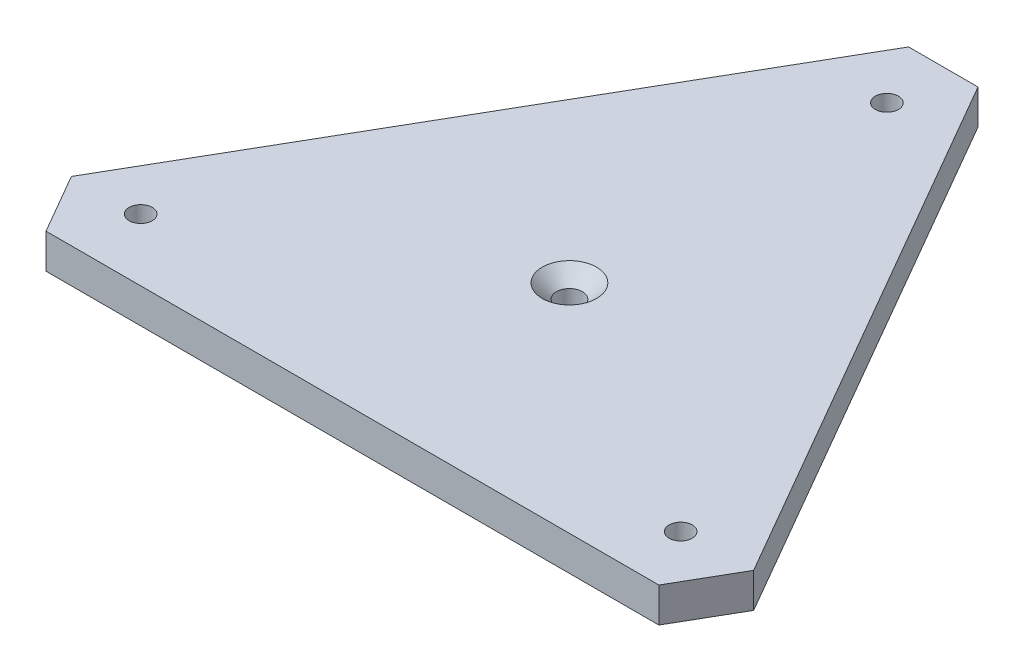
ISO-10303-21;
HEADER;
FILE_DESCRIPTION(('STEP AP214'),'2;1');
FILE_NAME('part.step','',(''),(''),'','','');
FILE_SCHEMA(('AUTOMOTIVE_DESIGN { 1 0 10303 214 1 1 1 1 }'));
ENDSEC;
DATA;
#1=APPLICATION_CONTEXT('core data for automotive mechanical design processes');
#2=APPLICATION_PROTOCOL_DEFINITION('international standard','automotive_design',2000,#1);
#3=PRODUCT_CONTEXT('',#1,'mechanical');
#4=PRODUCT('Part','Part','',(#3));
#5=PRODUCT_RELATED_PRODUCT_CATEGORY('part','',(#4));
#6=PRODUCT_DEFINITION_FORMATION('','',#4);
#7=PRODUCT_DEFINITION_CONTEXT('part definition',#1,'design');
#8=PRODUCT_DEFINITION('design','',#6,#7);
#9=PRODUCT_DEFINITION_SHAPE('','',#8);
#10=(LENGTH_UNIT() NAMED_UNIT(*) SI_UNIT(.MILLI.,.METRE.));
#11=(NAMED_UNIT(*) PLANE_ANGLE_UNIT() SI_UNIT($,.RADIAN.));
#12=(NAMED_UNIT(*) SI_UNIT($,.STERADIAN.) SOLID_ANGLE_UNIT());
#13=UNCERTAINTY_MEASURE_WITH_UNIT(LENGTH_MEASURE(1.E-05),#10,'distance_accuracy_value','');
#14=(GEOMETRIC_REPRESENTATION_CONTEXT(3) GLOBAL_UNCERTAINTY_ASSIGNED_CONTEXT((#13)) GLOBAL_UNIT_ASSIGNED_CONTEXT((#10,
#11,#12)) REPRESENTATION_CONTEXT('',''));
#15=CARTESIAN_POINT('',(0.,0.,0.));
#16=DIRECTION('',(0.,0.,1.));
#17=DIRECTION('',(1.,0.,0.));
#18=AXIS2_PLACEMENT_3D('',#15,#16,#17);
#19=CARTESIAN_POINT('',(0.,6.,37.5277674973257));
#20=DIRECTION('',(0.,0.,-1.));
#21=DIRECTION('',(-1.,0.,0.));
#22=AXIS2_PLACEMENT_3D('',#19,#20,#21);
#23=PLANE('',#22);
#24=DIRECTION('',(1.,0.,0.));
#25=VECTOR('',#24,1.);
#26=CARTESIAN_POINT('',(0.,0.,37.5277674973257));
#27=LINE('',#26,#25);
#28=CARTESIAN_POINT('',(-53.,0.,37.5277674973257));
#29=VERTEX_POINT('',#28);
#30=CARTESIAN_POINT('',(53.,0.,37.5277674973257));
#31=VERTEX_POINT('',#30);
#32=EDGE_CURVE('E406',#29,#31,#27,.T.);
#33=ORIENTED_EDGE('',*,*,#32,.T.);
#34=DIRECTION('',(0.,-1.,0.));
#35=VECTOR('',#34,1.);
#36=CARTESIAN_POINT('',(53.,6.,37.5277674973257));
#37=LINE('',#36,#35);
#38=CARTESIAN_POINT('',(53.,6.,37.5277674973257));
#39=VERTEX_POINT('',#38);
#40=EDGE_CURVE('E470',#39,#31,#37,.T.);
#41=ORIENTED_EDGE('',*,*,#40,.F.);
#42=DIRECTION('',(1.,0.,0.));
#43=VECTOR('',#42,1.);
#44=CARTESIAN_POINT('',(0.,6.,37.5277674973257));
#45=LINE('',#44,#43);
#46=CARTESIAN_POINT('',(-53.,6.,37.5277674973257));
#47=VERTEX_POINT('',#46);
#48=EDGE_CURVE('E408',#47,#39,#45,.T.);
#49=ORIENTED_EDGE('',*,*,#48,.F.);
#50=DIRECTION('',(0.,-1.,0.));
#51=VECTOR('',#50,1.);
#52=CARTESIAN_POINT('',(-53.,6.,37.5277674973257));
#53=LINE('',#52,#51);
#54=EDGE_CURVE('E427',#47,#29,#53,.T.);
#55=ORIENTED_EDGE('',*,*,#54,.T.);
#56=EDGE_LOOP('',(#33,#41,#49,#55));
#57=FACE_BOUND('',#56,.T.);
#58=ADVANCED_FACE('F50',(#57),#23,.F.);
#59=CARTESIAN_POINT('',(55.9999999999999,6.,32.3316150746193));
#60=DIRECTION('',(-0.866025403784437,0.,-0.500000000000004));
#61=DIRECTION('',(-0.500000000000004,0.,0.866025403784437));
#62=AXIS2_PLACEMENT_3D('',#59,#60,#61);
#63=PLANE('',#62);
#64=DIRECTION('',(0.500000000000004,0.,-0.866025403784437));
#65=VECTOR('',#64,1.);
#66=CARTESIAN_POINT('',(55.9999999999999,0.,32.3316150746193));
#67=LINE('',#66,#65);
#68=CARTESIAN_POINT('',(59.,0.,27.1354626519125));
#69=VERTEX_POINT('',#68);
#70=EDGE_CURVE('E432',#31,#69,#67,.T.);
#71=ORIENTED_EDGE('',*,*,#70,.T.);
#72=DIRECTION('',(0.,-1.,0.));
#73=VECTOR('',#72,1.);
#74=CARTESIAN_POINT('',(59.,6.,27.1354626519125));
#75=LINE('',#74,#73);
#76=CARTESIAN_POINT('',(59.,6.,27.1354626519125));
#77=VERTEX_POINT('',#76);
#78=EDGE_CURVE('E464',#77,#69,#75,.T.);
#79=ORIENTED_EDGE('',*,*,#78,.F.);
#80=DIRECTION('',(0.500000000000004,0.,-0.866025403784437));
#81=VECTOR('',#80,1.);
#82=CARTESIAN_POINT('',(55.9999999999999,6.,32.3316150746193));
#83=LINE('',#82,#81);
#84=EDGE_CURVE('E413',#39,#77,#83,.T.);
#85=ORIENTED_EDGE('',*,*,#84,.F.);
#86=ORIENTED_EDGE('',*,*,#40,.T.);
#87=EDGE_LOOP('',(#71,#79,#85,#86));
#88=FACE_BOUND('',#87,.T.);
#89=ADVANCED_FACE('F612',(#88),#63,.F.);
#90=CARTESIAN_POINT('',(32.5,6.,-18.7638837486628));
#91=DIRECTION('',(-0.866025403784438,0.,0.5));
#92=DIRECTION('',(0.5,0.,0.866025403784439));
#93=AXIS2_PLACEMENT_3D('',#90,#91,#92);
#94=PLANE('',#93);
#95=DIRECTION('',(-0.5,0.,-0.866025403784439));
#96=VECTOR('',#95,1.);
#97=CARTESIAN_POINT('',(32.5,0.,-18.7638837486628));
#98=LINE('',#97,#96);
#99=CARTESIAN_POINT('',(5.99999999999996,0.,-64.6632301492381));
#100=VERTEX_POINT('',#99);
#101=EDGE_CURVE('E440',#69,#100,#98,.T.);
#102=ORIENTED_EDGE('',*,*,#101,.T.);
#103=DIRECTION('',(0.,-1.,0.));
#104=VECTOR('',#103,1.);
#105=CARTESIAN_POINT('',(5.99999999999996,6.,-64.6632301492381));
#106=LINE('',#105,#104);
#107=CARTESIAN_POINT('',(5.99999999999996,6.,-64.6632301492381));
#108=VERTEX_POINT('',#107);
#109=EDGE_CURVE('E458',#108,#100,#106,.T.);
#110=ORIENTED_EDGE('',*,*,#109,.F.);
#111=DIRECTION('',(-0.5,0.,-0.866025403784439));
#112=VECTOR('',#111,1.);
#113=CARTESIAN_POINT('',(32.5,6.,-18.7638837486628));
#114=LINE('',#113,#112);
#115=EDGE_CURVE('E419',#77,#108,#114,.T.);
#116=ORIENTED_EDGE('',*,*,#115,.F.);
#117=ORIENTED_EDGE('',*,*,#78,.T.);
#118=EDGE_LOOP('',(#102,#110,#116,#117));
#119=FACE_BOUND('',#118,.T.);
#120=ADVANCED_FACE('F618',(#119),#94,.F.);
#121=CARTESIAN_POINT('',(2.24345646744749E-13,6.,-64.6632301492381));
#122=DIRECTION('',(0.,0.,1.));
#123=DIRECTION('',(1.,0.,0.));
#124=AXIS2_PLACEMENT_3D('',#121,#122,#123);
#125=PLANE('',#124);
#126=DIRECTION('',(-1.,0.,0.));
#127=VECTOR('',#126,1.);
#128=CARTESIAN_POINT('',(2.24345646744749E-13,0.,-64.6632301492381));
#129=LINE('',#128,#127);
#130=CARTESIAN_POINT('',(-5.99999999999995,0.,-64.6632301492382));
#131=VERTEX_POINT('',#130);
#132=EDGE_CURVE('E439',#100,#131,#129,.T.);
#133=ORIENTED_EDGE('',*,*,#132,.T.);
#134=DIRECTION('',(0.,-1.,0.));
#135=VECTOR('',#134,1.);
#136=CARTESIAN_POINT('',(-5.99999999999995,6.,-64.6632301492382));
#137=LINE('',#136,#135);
#138=CARTESIAN_POINT('',(-5.99999999999995,6.,-64.6632301492382));
#139=VERTEX_POINT('',#138);
#140=EDGE_CURVE('E453',#139,#131,#137,.T.);
#141=ORIENTED_EDGE('',*,*,#140,.F.);
#142=DIRECTION('',(-1.,0.,0.));
#143=VECTOR('',#142,1.);
#144=CARTESIAN_POINT('',(2.24345646744749E-13,6.,-64.6632301492381));
#145=LINE('',#144,#143);
#146=EDGE_CURVE('E423',#108,#139,#145,.T.);
#147=ORIENTED_EDGE('',*,*,#146,.F.);
#148=ORIENTED_EDGE('',*,*,#109,.T.);
#149=EDGE_LOOP('',(#133,#141,#147,#148));
#150=FACE_BOUND('',#149,.T.);
#151=ADVANCED_FACE('F637',(#150),#125,.F.);
#152=CARTESIAN_POINT('',(-32.5,6.,-18.7638837486628));
#153=DIRECTION('',(0.866025403784438,0.,0.5));
#154=DIRECTION('',(0.5,0.,-0.866025403784439));
#155=AXIS2_PLACEMENT_3D('',#152,#153,#154);
#156=PLANE('',#155);
#157=DIRECTION('',(-0.5,0.,0.866025403784439));
#158=VECTOR('',#157,1.);
#159=CARTESIAN_POINT('',(-32.5,0.,-18.7638837486628));
#160=LINE('',#159,#158);
#161=CARTESIAN_POINT('',(-59.,0.,27.1354626519123));
#162=VERTEX_POINT('',#161);
#163=EDGE_CURVE('E442',#131,#162,#160,.T.);
#164=ORIENTED_EDGE('',*,*,#163,.T.);
#165=DIRECTION('',(0.,-1.,0.));
#166=VECTOR('',#165,1.);
#167=CARTESIAN_POINT('',(-59.,6.,27.1354626519123));
#168=LINE('',#167,#166);
#169=CARTESIAN_POINT('',(-59.,6.,27.1354626519123));
#170=VERTEX_POINT('',#169);
#171=EDGE_CURVE('E452',#170,#162,#168,.T.);
#172=ORIENTED_EDGE('',*,*,#171,.F.);
#173=DIRECTION('',(-0.5,0.,0.866025403784439));
#174=VECTOR('',#173,1.);
#175=CARTESIAN_POINT('',(-32.5,6.,-18.7638837486628));
#176=LINE('',#175,#174);
#177=EDGE_CURVE('E425',#139,#170,#176,.T.);
#178=ORIENTED_EDGE('',*,*,#177,.F.);
#179=ORIENTED_EDGE('',*,*,#140,.T.);
#180=EDGE_LOOP('',(#164,#172,#178,#179));
#181=FACE_BOUND('',#180,.T.);
#182=ADVANCED_FACE('F634',(#181),#156,.F.);
#183=CARTESIAN_POINT('',(-56.0000000000001,6.,32.3316150746188));
#184=DIRECTION('',(0.866025403784441,0.,-0.499999999999996));
#185=DIRECTION('',(-0.499999999999996,0.,-0.866025403784441));
#186=AXIS2_PLACEMENT_3D('',#183,#184,#185);
#187=PLANE('',#186);
#188=DIRECTION('',(0.499999999999996,0.,0.866025403784441));
#189=VECTOR('',#188,1.);
#190=CARTESIAN_POINT('',(-56.0000000000001,0.,32.3316150746188));
#191=LINE('',#190,#189);
#192=EDGE_CURVE('E414',#162,#29,#191,.T.);
#193=ORIENTED_EDGE('',*,*,#192,.T.);
#194=ORIENTED_EDGE('',*,*,#54,.F.);
#195=DIRECTION('',(0.499999999999996,0.,0.866025403784441));
#196=VECTOR('',#195,1.);
#197=CARTESIAN_POINT('',(-56.0000000000001,6.,32.3316150746188));
#198=LINE('',#197,#196);
#199=EDGE_CURVE('E430',#170,#47,#198,.T.);
#200=ORIENTED_EDGE('',*,*,#199,.F.);
#201=ORIENTED_EDGE('',*,*,#171,.T.);
#202=EDGE_LOOP('',(#193,#194,#200,#201));
#203=FACE_BOUND('',#202,.T.);
#204=ADVANCED_FACE('F493',(#203),#187,.F.);
#205=CARTESIAN_POINT('',(0.,6.,0.));
#206=DIRECTION('',(0.,1.,0.));
#207=DIRECTION('',(0.,0.,1.));
#208=AXIS2_PLACEMENT_3D('',#205,#206,#207);
#209=PLANE('',#208);
#210=CARTESIAN_POINT('',(-47.3727409249304,6.000012,26.7800196226992));
#211=DIRECTION('',(0.,1.,0.));
#212=DIRECTION('',(0.,0.,1.));
#213=AXIS2_PLACEMENT_3D('',#210,#211,#212);
#214=CIRCLE('',#213,1.99999999999998);
#215=CARTESIAN_POINT('',(-47.3727409249304,6.000012,28.7800196226991));
#216=VERTEX_POINT('',#215);
#217=EDGE_CURVE('E347',#216,#216,#214,.T.);
#218=ORIENTED_EDGE('',*,*,#217,.F.);
#219=EDGE_LOOP('',(#218));
#220=FACE_BOUND('',#219,.T.);
#221=CARTESIAN_POINT('',(0.49419315536223,6.000012,-54.4160068992381));
#222=DIRECTION('',(0.,1.,0.));
#223=DIRECTION('',(0.,0.,1.));
#224=AXIS2_PLACEMENT_3D('',#221,#222,#223);
#225=CIRCLE('',#224,1.99999999999997);
#226=CARTESIAN_POINT('',(0.49419315536223,6.000012,-52.4160068992381));
#227=VERTEX_POINT('',#226);
#228=EDGE_CURVE('E512',#227,#227,#225,.T.);
#229=ORIENTED_EDGE('',*,*,#228,.F.);
#230=EDGE_LOOP('',(#229));
#231=FACE_BOUND('',#230,.T.);
#232=CARTESIAN_POINT('',(46.8785477695682,6.000012,27.6359872765393));
#233=DIRECTION('',(0.,1.,0.));
#234=DIRECTION('',(0.,0.,1.));
#235=AXIS2_PLACEMENT_3D('',#232,#233,#234);
#236=CIRCLE('',#235,1.99999999999997);
#237=CARTESIAN_POINT('',(46.8785477695682,6.000012,29.6359872765393));
#238=VERTEX_POINT('',#237);
#239=EDGE_CURVE('E389',#238,#238,#236,.T.);
#240=ORIENTED_EDGE('',*,*,#239,.F.);
#241=EDGE_LOOP('',(#240));
#242=FACE_BOUND('',#241,.T.);
#243=CARTESIAN_POINT('',(0.,6.,0.));
#244=DIRECTION('',(0.,1.,0.));
#245=DIRECTION('',(0.,0.,1.));
#246=AXIS2_PLACEMENT_3D('',#243,#244,#245);
#247=CIRCLE('',#246,4.7);
#248=CARTESIAN_POINT('',(0.,6.,4.7));
#249=VERTEX_POINT('',#248);
#250=EDGE_CURVE('E395',#249,#249,#247,.T.);
#251=ORIENTED_EDGE('',*,*,#250,.F.);
#252=EDGE_LOOP('',(#251));
#253=FACE_BOUND('',#252,.T.);
#254=ORIENTED_EDGE('',*,*,#48,.T.);
#255=ORIENTED_EDGE('',*,*,#84,.T.);
#256=ORIENTED_EDGE('',*,*,#115,.T.);
#257=ORIENTED_EDGE('',*,*,#146,.T.);
#258=ORIENTED_EDGE('',*,*,#177,.T.);
#259=ORIENTED_EDGE('',*,*,#199,.T.);
#260=EDGE_LOOP('',(#254,#255,#256,#257,#258,#259));
#261=FACE_BOUND('',#260,.T.);
#262=ADVANCED_FACE('F479',(#220,#231,#242,#253,#261),#209,.T.);
#263=CARTESIAN_POINT('',(0.,0.,0.));
#264=DIRECTION('',(0.,1.,0.));
#265=DIRECTION('',(0.,0.,1.));
#266=AXIS2_PLACEMENT_3D('',#263,#264,#265);
#267=PLANE('',#266);
#268=DIRECTION('',(0.909561910988799,0.,-0.415568442110808));
#269=VECTOR('',#268,1.);
#270=CARTESIAN_POINT('',(3.36463729136853,0.,7.36424043408311));
#271=LINE('',#270,#269);
#272=CARTESIAN_POINT('',(-47.7480091741784,0.,30.7170244581597));
#273=VERTEX_POINT('',#272);
#274=CARTESIAN_POINT('',(-44.1508288472234,0.,29.0735138775119));
#275=VERTEX_POINT('',#274);
#276=EDGE_CURVE('E54',#273,#275,#271,.T.);
#277=ORIENTED_EDGE('',*,*,#276,.T.);
#278=DIRECTION('',(0.0948881276153086,0.,-0.995487942286425));
#279=VECTOR('',#278,1.);
#280=CARTESIAN_POINT('',(-41.0070217832119,0.,-3.90871586767005));
#281=LINE('',#280,#279);
#282=CARTESIAN_POINT('',(-43.7755605979754,0.,25.1365090420513));
#283=VERTEX_POINT('',#282);
#284=EDGE_CURVE('E11',#275,#283,#281,.T.);
#285=ORIENTED_EDGE('',*,*,#284,.T.);
#286=DIRECTION('',(-0.814673783373487,0.,-0.57991950017561));
#287=VECTOR('',#286,1.);
#288=CARTESIAN_POINT('',(-26.59763449089,0.,37.364488541801));
#289=LINE('',#288,#287);
#290=CARTESIAN_POINT('',(-46.9974726756825,0.,22.8430147872386));
#291=VERTEX_POINT('',#290);
#292=EDGE_CURVE('E212',#283,#291,#289,.T.);
#293=ORIENTED_EDGE('',*,*,#292,.T.);
#294=DIRECTION('',(-0.909561910988797,0.,0.415568442110812));
#295=VECTOR('',#294,1.);
#296=CARTESIAN_POINT('',(0.517993462909389,0.,1.13374134380959));
#297=LINE('',#296,#295);
#298=CARTESIAN_POINT('',(-50.5946530026374,0.,24.4865253678864));
#299=VERTEX_POINT('',#298);
#300=EDGE_CURVE('E574',#291,#299,#297,.T.);
#301=ORIENTED_EDGE('',*,*,#300,.T.);
#302=DIRECTION('',(-0.0948881276153154,0.,0.995487942286425));
#303=VECTOR('',#302,1.);
#304=CARTESIAN_POINT('',(-47.8261141878737,0.,-4.55869954183522));
#305=LINE('',#304,#303);
#306=CARTESIAN_POINT('',(-50.9699212518854,0.,28.423530203347));
#307=VERTEX_POINT('',#306);
#308=EDGE_CURVE('E576',#299,#307,#305,.T.);
#309=ORIENTED_EDGE('',*,*,#308,.T.);
#310=DIRECTION('',(0.814673783373483,0.,0.579919500175615));
#311=VECTOR('',#310,1.);
#312=CARTESIAN_POINT('',(-30.5700830670934,0.,42.9450039579093));
#313=LINE('',#312,#311);
#314=EDGE_CURVE('E584',#307,#273,#313,.T.);
#315=ORIENTED_EDGE('',*,*,#314,.T.);
#316=EDGE_LOOP('',(#277,#285,#293,#301,#309,#315));
#317=FACE_BOUND('',#316,.T.);
#318=DIRECTION('',(-0.0948881276153142,0.,0.995487942286425));
#319=VECTOR('',#318,1.);
#320=CARTESIAN_POINT('',(-8.05993794117638,0.,-0.768258848195882));
#321=LINE('',#320,#319);
#322=CARTESIAN_POINT('',(-2.72771892234482,0.,-56.7095011540507));
#323=VERTEX_POINT('',#322);
#324=CARTESIAN_POINT('',(-3.10298717159278,0.,-52.7724963185902));
#325=VERTEX_POINT('',#324);
#326=EDGE_CURVE('E564',#323,#325,#321,.T.);
#327=ORIENTED_EDGE('',*,*,#326,.T.);
#328=DIRECTION('',(0.814673783373484,0.,0.579919500175614));
#329=VECTOR('',#328,1.);
#330=CARTESIAN_POINT('',(23.8885581291837,0.,-33.5587646639682));
#331=LINE('',#330,#329);
#332=CARTESIAN_POINT('',(0.118924906114242,0.,-50.4790020637775));
#333=VERTEX_POINT('',#332);
#334=EDGE_CURVE('E567',#325,#333,#331,.T.);
#335=ORIENTED_EDGE('',*,*,#334,.T.);
#336=DIRECTION('',(0.909561910988798,0.,-0.415568442110811));
#337=VECTOR('',#336,1.);
#338=CARTESIAN_POINT('',(-19.059779031167,0.,-41.7164714205846));
#339=LINE('',#338,#337);
#340=CARTESIAN_POINT('',(3.71610523306925,0.,-52.1225126444253));
#341=VERTEX_POINT('',#340);
#342=EDGE_CURVE('E546',#333,#341,#339,.T.);
#343=ORIENTED_EDGE('',*,*,#342,.T.);
#344=DIRECTION('',(0.0948881276153139,0.,-0.995487942286425));
#345=VECTOR('',#344,1.);
#346=CARTESIAN_POINT('',(-1.24084553651433,0.,-0.118275174030975));
#347=LINE('',#346,#345);
#348=CARTESIAN_POINT('',(4.09137348231721,0.,-56.0595174798858));
#349=VERTEX_POINT('',#348);
#350=EDGE_CURVE('E551',#341,#349,#347,.T.);
#351=ORIENTED_EDGE('',*,*,#350,.T.);
#352=DIRECTION('',(-0.814673783373485,0.,-0.579919500175613));
#353=VECTOR('',#352,1.);
#354=CARTESIAN_POINT('',(27.8610067053867,0.,-39.1392800800767));
#355=LINE('',#354,#353);
#356=CARTESIAN_POINT('',(0.869461404610184,0.,-58.3530117346986));
#357=VERTEX_POINT('',#356);
#358=EDGE_CURVE('E560',#349,#357,#355,.T.);
#359=ORIENTED_EDGE('',*,*,#358,.T.);
#360=DIRECTION('',(-0.909561910988797,0.,0.415568442110813));
#361=VECTOR('',#360,1.);
#362=CARTESIAN_POINT('',(-21.9064228596262,0.,-47.9469705108577));
#363=LINE('',#362,#361);
#364=EDGE_CURVE('E561',#357,#323,#363,.T.);
#365=ORIENTED_EDGE('',*,*,#364,.T.);
#366=EDGE_LOOP('',(#327,#335,#343,#351,#359,#365));
#367=FACE_BOUND('',#366,.T.);
#368=DIRECTION('',(-0.814673783373481,0.,-0.579919500175618));
#369=VECTOR('',#368,1.);
#370=CARTESIAN_POINT('',(4.69530064980804,0.,-6.59598158588684));
#371=LINE('',#370,#369);
#372=CARTESIAN_POINT('',(50.4757280965232,0.,25.9924766958915));
#373=VERTEX_POINT('',#372);
#374=CARTESIAN_POINT('',(47.2538160188162,0.,23.6989824410788));
#375=VERTEX_POINT('',#374);
#376=EDGE_CURVE('E541',#373,#375,#371,.T.);
#377=ORIENTED_EDGE('',*,*,#376,.T.);
#378=DIRECTION('',(-0.9095619109888,0.,0.415568442110807));
#379=VECTOR('',#378,1.);
#380=CARTESIAN_POINT('',(17.118463654028,0.,37.4674805316386));
#381=LINE('',#380,#379);
#382=CARTESIAN_POINT('',(43.6566356918612,0.,25.3424930217266));
#383=VERTEX_POINT('',#382);
#384=EDGE_CURVE('E544',#375,#383,#381,.T.);
#385=ORIENTED_EDGE('',*,*,#384,.T.);
#386=DIRECTION('',(-0.094888127615319,0.,0.995487942286424));
#387=VECTOR('',#386,1.);
#388=CARTESIAN_POINT('',(45.6574135220572,0.,4.35198287878392));
#389=LINE('',#388,#387);
#390=CARTESIAN_POINT('',(43.2813674426132,0.,29.2794978571871));
#391=VERTEX_POINT('',#390);
#392=EDGE_CURVE('E472',#383,#391,#389,.T.);
#393=ORIENTED_EDGE('',*,*,#392,.T.);
#394=DIRECTION('',(0.814673783373481,0.,0.579919500175618));
#395=VECTOR('',#394,1.);
#396=CARTESIAN_POINT('',(0.722852073605022,0.,-1.01546616977845));
#397=LINE('',#396,#395);
#398=CARTESIAN_POINT('',(46.5032795203202,0.,31.5729921119999));
#399=VERTEX_POINT('',#398);
#400=EDGE_CURVE('E526',#391,#399,#397,.T.);
#401=ORIENTED_EDGE('',*,*,#400,.T.);
#402=DIRECTION('',(0.909561910988799,0.,-0.415568442110807));
#403=VECTOR('',#402,1.);
#404=CARTESIAN_POINT('',(19.9651074824871,0.,43.6979796219119));
#405=LINE('',#404,#403);
#406=CARTESIAN_POINT('',(50.1004598472752,0.,29.929481531352));
#407=VERTEX_POINT('',#406);
#408=EDGE_CURVE('E531',#399,#407,#405,.T.);
#409=ORIENTED_EDGE('',*,*,#408,.T.);
#410=DIRECTION('',(0.094888127615317,0.,-0.995487942286424));
#411=VECTOR('',#410,1.);
#412=CARTESIAN_POINT('',(52.4765059267192,0.,5.00196655294875));
#413=LINE('',#412,#411);
#414=EDGE_CURVE('E540',#407,#373,#413,.T.);
#415=ORIENTED_EDGE('',*,*,#414,.T.);
#416=EDGE_LOOP('',(#377,#385,#393,#401,#409,#415));
#417=FACE_BOUND('',#416,.T.);
#418=CARTESIAN_POINT('',(0.,0.,0.));
#419=DIRECTION('',(0.,1.,0.));
#420=DIRECTION('',(0.,0.,1.));
#421=AXIS2_PLACEMENT_3D('',#418,#419,#420);
#422=CIRCLE('',#421,2.25);
#423=CARTESIAN_POINT('',(0.,0.,2.25));
#424=VERTEX_POINT('',#423);
#425=EDGE_CURVE('E403',#424,#424,#422,.T.);
#426=ORIENTED_EDGE('',*,*,#425,.T.);
#427=EDGE_LOOP('',(#426));
#428=FACE_BOUND('',#427,.T.);
#429=ORIENTED_EDGE('',*,*,#32,.F.);
#430=ORIENTED_EDGE('',*,*,#192,.F.);
#431=ORIENTED_EDGE('',*,*,#163,.F.);
#432=ORIENTED_EDGE('',*,*,#132,.F.);
#433=ORIENTED_EDGE('',*,*,#101,.F.);
#434=ORIENTED_EDGE('',*,*,#70,.F.);
#435=EDGE_LOOP('',(#429,#430,#431,#432,#433,#434));
#436=FACE_BOUND('',#435,.T.);
#437=ADVANCED_FACE('F489',(#317,#367,#417,#428,#436),#267,.F.);
#438=CARTESIAN_POINT('',(0.,6.,0.));
#439=DIRECTION('',(0.,1.,0.));
#440=DIRECTION('',(0.,0.,1.));
#441=AXIS2_PLACEMENT_3D('',#438,#439,#440);
#442=CYLINDRICAL_SURFACE('',#441,2.25);
#443=ORIENTED_EDGE('',*,*,#425,.F.);
#444=EDGE_LOOP('',(#443));
#445=FACE_BOUND('',#444,.T.);
#446=CARTESIAN_POINT('',(0.,3.55,0.));
#447=DIRECTION('',(0.,1.,0.));
#448=DIRECTION('',(0.,0.,1.));
#449=AXIS2_PLACEMENT_3D('',#446,#447,#448);
#450=CIRCLE('',#449,2.25);
#451=CARTESIAN_POINT('',(0.,3.55,2.25));
#452=VERTEX_POINT('',#451);
#453=EDGE_CURVE('E402',#452,#452,#450,.T.);
#454=ORIENTED_EDGE('',*,*,#453,.T.);
#455=EDGE_LOOP('',(#454));
#456=FACE_BOUND('',#455,.T.);
#457=ADVANCED_FACE('F491',(#445,#456),#442,.F.);
#458=CARTESIAN_POINT('',(0.,6.,0.));
#459=DIRECTION('',(0.,1.,0.));
#460=DIRECTION('',(0.,0.,1.));
#461=AXIS2_PLACEMENT_3D('',#458,#459,#460);
#462=CONICAL_SURFACE('',#461,4.7,0.785398163397448);
#463=ORIENTED_EDGE('',*,*,#453,.F.);
#464=EDGE_LOOP('',(#463));
#465=FACE_BOUND('',#464,.T.);
#466=ORIENTED_EDGE('',*,*,#250,.T.);
#467=EDGE_LOOP('',(#466));
#468=FACE_BOUND('',#467,.T.);
#469=ADVANCED_FACE('F661',(#465,#468),#462,.F.);
#470=CARTESIAN_POINT('',(46.8785477695682,0.,27.6359872765393));
#471=DIRECTION('',(0.,1.,0.));
#472=DIRECTION('',(0.,0.,1.));
#473=AXIS2_PLACEMENT_3D('',#470,#471,#472);
#474=CYLINDRICAL_SURFACE('',#473,1.99999999999997);
#475=CARTESIAN_POINT('',(46.8785477695682,3.,27.6359872765393));
#476=DIRECTION('',(0.,1.,0.));
#477=DIRECTION('',(0.,0.,1.));
#478=AXIS2_PLACEMENT_3D('',#475,#476,#477);
#479=CIRCLE('',#478,1.99999999999997);
#480=CARTESIAN_POINT('',(46.8785477695682,3.,29.6359872765393));
#481=VERTEX_POINT('',#480);
#482=EDGE_CURVE('E513',#481,#481,#479,.F.);
#483=ORIENTED_EDGE('',*,*,#482,.T.);
#484=EDGE_LOOP('',(#483));
#485=FACE_BOUND('',#484,.T.);
#486=ORIENTED_EDGE('',*,*,#239,.T.);
#487=EDGE_LOOP('',(#486));
#488=FACE_BOUND('',#487,.T.);
#489=ADVANCED_FACE('F375',(#485,#488),#474,.F.);
#490=CARTESIAN_POINT('',(0.49419315536223,0.,-54.4160068992381));
#491=DIRECTION('',(0.,1.,0.));
#492=DIRECTION('',(0.,0.,1.));
#493=AXIS2_PLACEMENT_3D('',#490,#491,#492);
#494=CYLINDRICAL_SURFACE('',#493,1.99999999999997);
#495=CARTESIAN_POINT('',(0.49419315536223,3.,-54.4160068992381));
#496=DIRECTION('',(0.,1.,0.));
#497=DIRECTION('',(0.,0.,1.));
#498=AXIS2_PLACEMENT_3D('',#495,#496,#497);
#499=CIRCLE('',#498,1.99999999999997);
#500=CARTESIAN_POINT('',(0.49419315536223,3.,-52.4160068992381));
#501=VERTEX_POINT('',#500);
#502=EDGE_CURVE('E519',#501,#501,#499,.F.);
#503=ORIENTED_EDGE('',*,*,#502,.T.);
#504=EDGE_LOOP('',(#503));
#505=FACE_BOUND('',#504,.T.);
#506=ORIENTED_EDGE('',*,*,#228,.T.);
#507=EDGE_LOOP('',(#506));
#508=FACE_BOUND('',#507,.T.);
#509=ADVANCED_FACE('F362',(#505,#508),#494,.F.);
#510=CARTESIAN_POINT('',(-47.3727409249304,0.,26.7800196226992));
#511=DIRECTION('',(0.,1.,0.));
#512=DIRECTION('',(0.,0.,1.));
#513=AXIS2_PLACEMENT_3D('',#510,#511,#512);
#514=CYLINDRICAL_SURFACE('',#513,1.99999999999998);
#515=CARTESIAN_POINT('',(-47.3727409249304,3.,26.7800196226992));
#516=DIRECTION('',(0.,1.,0.));
#517=DIRECTION('',(0.,0.,1.));
#518=AXIS2_PLACEMENT_3D('',#515,#516,#517);
#519=CIRCLE('',#518,1.99999999999998);
#520=CARTESIAN_POINT('',(-47.3727409249304,3.,28.7800196226991));
#521=VERTEX_POINT('',#520);
#522=EDGE_CURVE('E253',#521,#521,#519,.F.);
#523=ORIENTED_EDGE('',*,*,#522,.T.);
#524=EDGE_LOOP('',(#523));
#525=FACE_BOUND('',#524,.T.);
#526=ORIENTED_EDGE('',*,*,#217,.T.);
#527=EDGE_LOOP('',(#526));
#528=FACE_BOUND('',#527,.T.);
#529=ADVANCED_FACE('F353',(#525,#528),#514,.F.);
#530=CARTESIAN_POINT('',(-44.1508288472234,-7.,29.0735138775119));
#531=DIRECTION('',(0.995487942286425,0.,0.0948881276153086));
#532=DIRECTION('',(0.0948881276153086,0.,-0.995487942286425));
#533=AXIS2_PLACEMENT_3D('',#530,#531,#532);
#534=PLANE('',#533);
#535=DIRECTION('',(0.,1.,0.));
#536=VECTOR('',#535,1.);
#537=CARTESIAN_POINT('',(-44.1508288472234,-7.,29.0735138775119));
#538=LINE('',#537,#536);
#539=CARTESIAN_POINT('',(-44.1508288472234,3.,29.0735138775119));
#540=VERTEX_POINT('',#539);
#541=EDGE_CURVE('E235',#275,#540,#538,.T.);
#542=ORIENTED_EDGE('',*,*,#541,.T.);
#543=DIRECTION('',(0.0948881276153086,0.,-0.995487942286425));
#544=VECTOR('',#543,1.);
#545=CARTESIAN_POINT('',(-44.1508288472234,3.,29.0735138775119));
#546=LINE('',#545,#544);
#547=CARTESIAN_POINT('',(-43.7755605979754,3.,25.1365090420513));
#548=VERTEX_POINT('',#547);
#549=EDGE_CURVE('E224',#540,#548,#546,.T.);
#550=ORIENTED_EDGE('',*,*,#549,.T.);
#551=DIRECTION('',(0.,1.,0.));
#552=VECTOR('',#551,1.);
#553=CARTESIAN_POINT('',(-43.7755605979754,-7.,25.1365090420513));
#554=LINE('',#553,#552);
#555=EDGE_CURVE('E207',#283,#548,#554,.T.);
#556=ORIENTED_EDGE('',*,*,#555,.F.);
#557=ORIENTED_EDGE('',*,*,#284,.F.);
#558=EDGE_LOOP('',(#542,#550,#556,#557));
#559=FACE_BOUND('',#558,.T.);
#560=ADVANCED_FACE('F229',(#559),#534,.F.);
#561=CARTESIAN_POINT('',(-47.7480091741784,-7.,30.7170244581597));
#562=DIRECTION('',(0.415568442110808,0.,0.909561910988799));
#563=DIRECTION('',(0.909561910988799,0.,-0.415568442110808));
#564=AXIS2_PLACEMENT_3D('',#561,#562,#563);
#565=PLANE('',#564);
#566=DIRECTION('',(0.,1.,0.));
#567=VECTOR('',#566,1.);
#568=CARTESIAN_POINT('',(-47.7480091741784,-7.,30.7170244581597));
#569=LINE('',#568,#567);
#570=CARTESIAN_POINT('',(-47.7480091741784,3.,30.7170244581597));
#571=VERTEX_POINT('',#570);
#572=EDGE_CURVE('E257',#273,#571,#569,.T.);
#573=ORIENTED_EDGE('',*,*,#572,.T.);
#574=DIRECTION('',(0.909561910988799,0.,-0.415568442110808));
#575=VECTOR('',#574,1.);
#576=CARTESIAN_POINT('',(-47.7480091741784,3.,30.7170244581597));
#577=LINE('',#576,#575);
#578=EDGE_CURVE('E213',#571,#540,#577,.T.);
#579=ORIENTED_EDGE('',*,*,#578,.T.);
#580=ORIENTED_EDGE('',*,*,#541,.F.);
#581=ORIENTED_EDGE('',*,*,#276,.F.);
#582=EDGE_LOOP('',(#573,#579,#580,#581));
#583=FACE_BOUND('',#582,.T.);
#584=ADVANCED_FACE('F595',(#583),#565,.F.);
#585=CARTESIAN_POINT('',(-50.9699212518854,-7.,28.423530203347));
#586=DIRECTION('',(-0.579919500175615,0.,0.814673783373483));
#587=DIRECTION('',(0.814673783373483,0.,0.579919500175615));
#588=AXIS2_PLACEMENT_3D('',#585,#586,#587);
#589=PLANE('',#588);
#590=DIRECTION('',(0.,1.,0.));
#591=VECTOR('',#590,1.);
#592=CARTESIAN_POINT('',(-50.9699212518854,-7.,28.423530203347));
#593=LINE('',#592,#591);
#594=CARTESIAN_POINT('',(-50.9699212518854,3.,28.423530203347));
#595=VERTEX_POINT('',#594);
#596=EDGE_CURVE('E256',#307,#595,#593,.T.);
#597=ORIENTED_EDGE('',*,*,#596,.T.);
#598=DIRECTION('',(0.814673783373483,0.,0.579919500175615));
#599=VECTOR('',#598,1.);
#600=CARTESIAN_POINT('',(-50.9699212518854,3.,28.423530203347));
#601=LINE('',#600,#599);
#602=EDGE_CURVE('E250',#595,#571,#601,.T.);
#603=ORIENTED_EDGE('',*,*,#602,.T.);
#604=ORIENTED_EDGE('',*,*,#572,.F.);
#605=ORIENTED_EDGE('',*,*,#314,.F.);
#606=EDGE_LOOP('',(#597,#603,#604,#605));
#607=FACE_BOUND('',#606,.T.);
#608=ADVANCED_FACE('F591',(#607),#589,.F.);
#609=CARTESIAN_POINT('',(-50.5946530026374,-7.,24.4865253678864));
#610=DIRECTION('',(-0.995487942286425,0.,-0.0948881276153154));
#611=DIRECTION('',(-0.0948881276153154,0.,0.995487942286425));
#612=AXIS2_PLACEMENT_3D('',#609,#610,#611);
#613=PLANE('',#612);
#614=DIRECTION('',(0.,1.,0.));
#615=VECTOR('',#614,1.);
#616=CARTESIAN_POINT('',(-50.5946530026374,-7.,24.4865253678864));
#617=LINE('',#616,#615);
#618=CARTESIAN_POINT('',(-50.5946530026374,3.,24.4865253678864));
#619=VERTEX_POINT('',#618);
#620=EDGE_CURVE('E265',#299,#619,#617,.T.);
#621=ORIENTED_EDGE('',*,*,#620,.T.);
#622=DIRECTION('',(-0.0948881276153154,0.,0.995487942286424));
#623=VECTOR('',#622,1.);
#624=CARTESIAN_POINT('',(-50.5946530026374,3.,24.4865253678864));
#625=LINE('',#624,#623);
#626=EDGE_CURVE('E243',#619,#595,#625,.T.);
#627=ORIENTED_EDGE('',*,*,#626,.T.);
#628=ORIENTED_EDGE('',*,*,#596,.F.);
#629=ORIENTED_EDGE('',*,*,#308,.F.);
#630=EDGE_LOOP('',(#621,#627,#628,#629));
#631=FACE_BOUND('',#630,.T.);
#632=ADVANCED_FACE('F596',(#631),#613,.F.);
#633=CARTESIAN_POINT('',(-46.9974726756825,-7.,22.8430147872386));
#634=DIRECTION('',(-0.415568442110812,0.,-0.909561910988797));
#635=DIRECTION('',(-0.909561910988797,0.,0.415568442110812));
#636=AXIS2_PLACEMENT_3D('',#633,#634,#635);
#637=PLANE('',#636);
#638=DIRECTION('',(0.,1.,0.));
#639=VECTOR('',#638,1.);
#640=CARTESIAN_POINT('',(-46.9974726756825,-7.,22.8430147872386));
#641=LINE('',#640,#639);
#642=CARTESIAN_POINT('',(-46.9974726756825,3.,22.8430147872386));
#643=VERTEX_POINT('',#642);
#644=EDGE_CURVE('E65',#291,#643,#641,.T.);
#645=ORIENTED_EDGE('',*,*,#644,.T.);
#646=DIRECTION('',(-0.909561910988797,0.,0.415568442110812));
#647=VECTOR('',#646,1.);
#648=CARTESIAN_POINT('',(-46.9974726756825,3.,22.8430147872386));
#649=LINE('',#648,#647);
#650=EDGE_CURVE('E227',#643,#619,#649,.T.);
#651=ORIENTED_EDGE('',*,*,#650,.T.);
#652=ORIENTED_EDGE('',*,*,#620,.F.);
#653=ORIENTED_EDGE('',*,*,#300,.F.);
#654=EDGE_LOOP('',(#645,#651,#652,#653));
#655=FACE_BOUND('',#654,.T.);
#656=ADVANCED_FACE('F602',(#655),#637,.F.);
#657=CARTESIAN_POINT('',(-43.7755605979754,-7.,25.1365090420513));
#658=DIRECTION('',(0.57991950017561,0.,-0.814673783373487));
#659=DIRECTION('',(-0.814673783373487,0.,-0.57991950017561));
#660=AXIS2_PLACEMENT_3D('',#657,#658,#659);
#661=PLANE('',#660);
#662=ORIENTED_EDGE('',*,*,#555,.T.);
#663=DIRECTION('',(-0.814673783373487,0.,-0.57991950017561));
#664=VECTOR('',#663,1.);
#665=CARTESIAN_POINT('',(-43.7755605979754,3.,25.1365090420513));
#666=LINE('',#665,#664);
#667=EDGE_CURVE('E209',#548,#643,#666,.T.);
#668=ORIENTED_EDGE('',*,*,#667,.T.);
#669=ORIENTED_EDGE('',*,*,#644,.F.);
#670=ORIENTED_EDGE('',*,*,#292,.F.);
#671=EDGE_LOOP('',(#662,#668,#669,#670));
#672=FACE_BOUND('',#671,.T.);
#673=ADVANCED_FACE('F206',(#672),#661,.F.);
#674=CARTESIAN_POINT('',(0.,3.,0.));
#675=DIRECTION('',(0.,1.,0.));
#676=DIRECTION('',(0.,0.,1.));
#677=AXIS2_PLACEMENT_3D('',#674,#675,#676);
#678=PLANE('',#677);
#679=ORIENTED_EDGE('',*,*,#549,.F.);
#680=ORIENTED_EDGE('',*,*,#578,.F.);
#681=ORIENTED_EDGE('',*,*,#602,.F.);
#682=ORIENTED_EDGE('',*,*,#626,.F.);
#683=ORIENTED_EDGE('',*,*,#650,.F.);
#684=ORIENTED_EDGE('',*,*,#667,.F.);
#685=EDGE_LOOP('',(#679,#680,#681,#682,#683,#684));
#686=FACE_BOUND('',#685,.T.);
#687=ORIENTED_EDGE('',*,*,#522,.F.);
#688=EDGE_LOOP('',(#687));
#689=FACE_BOUND('',#688,.T.);
#690=ADVANCED_FACE('F219',(#686,#689),#678,.F.);
#691=CARTESIAN_POINT('',(-3.10298717159278,-7.,-52.7724963185902));
#692=DIRECTION('',(-0.579919500175614,0.,0.814673783373484));
#693=DIRECTION('',(0.814673783373484,0.,0.579919500175614));
#694=AXIS2_PLACEMENT_3D('',#691,#692,#693);
#695=PLANE('',#694);
#696=DIRECTION('',(0.,1.,0.));
#697=VECTOR('',#696,1.);
#698=CARTESIAN_POINT('',(-3.10298717159278,-7.,-52.7724963185902));
#699=LINE('',#698,#697);
#700=CARTESIAN_POINT('',(-3.10298717159278,3.,-52.7724963185902));
#701=VERTEX_POINT('',#700);
#702=EDGE_CURVE('E285',#325,#701,#699,.T.);
#703=ORIENTED_EDGE('',*,*,#702,.T.);
#704=DIRECTION('',(0.814673783373484,0.,0.579919500175614));
#705=VECTOR('',#704,1.);
#706=CARTESIAN_POINT('',(-3.10298717159278,3.,-52.7724963185902));
#707=LINE('',#706,#705);
#708=CARTESIAN_POINT('',(0.118924906114242,3.,-50.4790020637775));
#709=VERTEX_POINT('',#708);
#710=EDGE_CURVE('E234',#701,#709,#707,.T.);
#711=ORIENTED_EDGE('',*,*,#710,.T.);
#712=DIRECTION('',(0.,1.,0.));
#713=VECTOR('',#712,1.);
#714=CARTESIAN_POINT('',(0.118924906114242,-7.,-50.4790020637775));
#715=LINE('',#714,#713);
#716=EDGE_CURVE('E270',#333,#709,#715,.T.);
#717=ORIENTED_EDGE('',*,*,#716,.F.);
#718=ORIENTED_EDGE('',*,*,#334,.F.);
#719=EDGE_LOOP('',(#703,#711,#717,#718));
#720=FACE_BOUND('',#719,.T.);
#721=ADVANCED_FACE('F744',(#720),#695,.F.);
#722=CARTESIAN_POINT('',(-2.72771892234482,-7.,-56.7095011540507));
#723=DIRECTION('',(-0.995487942286425,0.,-0.0948881276153142));
#724=DIRECTION('',(-0.0948881276153142,0.,0.995487942286425));
#725=AXIS2_PLACEMENT_3D('',#722,#723,#724);
#726=PLANE('',#725);
#727=DIRECTION('',(0.,1.,0.));
#728=VECTOR('',#727,1.);
#729=CARTESIAN_POINT('',(-2.72771892234482,-7.,-56.7095011540507));
#730=LINE('',#729,#728);
#731=CARTESIAN_POINT('',(-2.72771892234482,3.,-56.7095011540507));
#732=VERTEX_POINT('',#731);
#733=EDGE_CURVE('E276',#323,#732,#730,.T.);
#734=ORIENTED_EDGE('',*,*,#733,.T.);
#735=DIRECTION('',(-0.0948881276153142,0.,0.995487942286425));
#736=VECTOR('',#735,1.);
#737=CARTESIAN_POINT('',(-2.72771892234482,3.,-56.7095011540507));
#738=LINE('',#737,#736);
#739=EDGE_CURVE('E268',#732,#701,#738,.T.);
#740=ORIENTED_EDGE('',*,*,#739,.T.);
#741=ORIENTED_EDGE('',*,*,#702,.F.);
#742=ORIENTED_EDGE('',*,*,#326,.F.);
#743=EDGE_LOOP('',(#734,#740,#741,#742));
#744=FACE_BOUND('',#743,.T.);
#745=ADVANCED_FACE('F755',(#744),#726,.F.);
#746=CARTESIAN_POINT('',(0.869461404610184,-7.,-58.3530117346986));
#747=DIRECTION('',(-0.415568442110813,0.,-0.909561910988797));
#748=DIRECTION('',(-0.909561910988797,0.,0.415568442110813));
#749=AXIS2_PLACEMENT_3D('',#746,#747,#748);
#750=PLANE('',#749);
#751=DIRECTION('',(0.,1.,0.));
#752=VECTOR('',#751,1.);
#753=CARTESIAN_POINT('',(0.869461404610184,-7.,-58.3530117346986));
#754=LINE('',#753,#752);
#755=CARTESIAN_POINT('',(0.869461404610184,3.,-58.3530117346986));
#756=VERTEX_POINT('',#755);
#757=EDGE_CURVE('E277',#357,#756,#754,.T.);
#758=ORIENTED_EDGE('',*,*,#757,.T.);
#759=DIRECTION('',(-0.909561910988797,0.,0.415568442110813));
#760=VECTOR('',#759,1.);
#761=CARTESIAN_POINT('',(0.869461404610184,3.,-58.3530117346986));
#762=LINE('',#761,#760);
#763=EDGE_CURVE('E286',#756,#732,#762,.T.);
#764=ORIENTED_EDGE('',*,*,#763,.T.);
#765=ORIENTED_EDGE('',*,*,#733,.F.);
#766=ORIENTED_EDGE('',*,*,#364,.F.);
#767=EDGE_LOOP('',(#758,#764,#765,#766));
#768=FACE_BOUND('',#767,.T.);
#769=ADVANCED_FACE('F765',(#768),#750,.F.);
#770=CARTESIAN_POINT('',(4.09137348231721,-7.,-56.0595174798858));
#771=DIRECTION('',(0.579919500175613,0.,-0.814673783373485));
#772=DIRECTION('',(-0.814673783373485,0.,-0.579919500175613));
#773=AXIS2_PLACEMENT_3D('',#770,#771,#772);
#774=PLANE('',#773);
#775=DIRECTION('',(0.,1.,0.));
#776=VECTOR('',#775,1.);
#777=CARTESIAN_POINT('',(4.09137348231721,-7.,-56.0595174798858));
#778=LINE('',#777,#776);
#779=CARTESIAN_POINT('',(4.09137348231721,3.,-56.0595174798858));
#780=VERTEX_POINT('',#779);
#781=EDGE_CURVE('E271',#349,#780,#778,.T.);
#782=ORIENTED_EDGE('',*,*,#781,.T.);
#783=DIRECTION('',(-0.814673783373485,0.,-0.579919500175613));
#784=VECTOR('',#783,1.);
#785=CARTESIAN_POINT('',(4.09137348231721,3.,-56.0595174798858));
#786=LINE('',#785,#784);
#787=EDGE_CURVE('E291',#780,#756,#786,.T.);
#788=ORIENTED_EDGE('',*,*,#787,.T.);
#789=ORIENTED_EDGE('',*,*,#757,.F.);
#790=ORIENTED_EDGE('',*,*,#358,.F.);
#791=EDGE_LOOP('',(#782,#788,#789,#790));
#792=FACE_BOUND('',#791,.T.);
#793=ADVANCED_FACE('F775',(#792),#774,.F.);
#794=CARTESIAN_POINT('',(3.71610523306925,-7.,-52.1225126444253));
#795=DIRECTION('',(0.995487942286425,0.,0.0948881276153139));
#796=DIRECTION('',(0.0948881276153139,0.,-0.995487942286425));
#797=AXIS2_PLACEMENT_3D('',#794,#795,#796);
#798=PLANE('',#797);
#799=DIRECTION('',(0.,1.,0.));
#800=VECTOR('',#799,1.);
#801=CARTESIAN_POINT('',(3.71610523306925,-7.,-52.1225126444253));
#802=LINE('',#801,#800);
#803=CARTESIAN_POINT('',(3.71610523306925,3.,-52.1225126444253));
#804=VERTEX_POINT('',#803);
#805=EDGE_CURVE('E69',#341,#804,#802,.T.);
#806=ORIENTED_EDGE('',*,*,#805,.T.);
#807=DIRECTION('',(0.0948881276153139,0.,-0.995487942286425));
#808=VECTOR('',#807,1.);
#809=CARTESIAN_POINT('',(3.71610523306925,3.,-52.1225126444253));
#810=LINE('',#809,#808);
#811=EDGE_CURVE('E300',#804,#780,#810,.T.);
#812=ORIENTED_EDGE('',*,*,#811,.T.);
#813=ORIENTED_EDGE('',*,*,#781,.F.);
#814=ORIENTED_EDGE('',*,*,#350,.F.);
#815=EDGE_LOOP('',(#806,#812,#813,#814));
#816=FACE_BOUND('',#815,.T.);
#817=ADVANCED_FACE('F785',(#816),#798,.F.);
#818=CARTESIAN_POINT('',(0.118924906114242,-7.,-50.4790020637775));
#819=DIRECTION('',(0.415568442110811,0.,0.909561910988798));
#820=DIRECTION('',(0.909561910988798,0.,-0.415568442110811));
#821=AXIS2_PLACEMENT_3D('',#818,#819,#820);
#822=PLANE('',#821);
#823=ORIENTED_EDGE('',*,*,#716,.T.);
#824=DIRECTION('',(0.909561910988798,0.,-0.415568442110811));
#825=VECTOR('',#824,1.);
#826=CARTESIAN_POINT('',(0.118924906114242,3.,-50.4790020637775));
#827=LINE('',#826,#825);
#828=EDGE_CURVE('E238',#709,#804,#827,.T.);
#829=ORIENTED_EDGE('',*,*,#828,.T.);
#830=ORIENTED_EDGE('',*,*,#805,.F.);
#831=ORIENTED_EDGE('',*,*,#342,.F.);
#832=EDGE_LOOP('',(#823,#829,#830,#831));
#833=FACE_BOUND('',#832,.T.);
#834=ADVANCED_FACE('F795',(#833),#822,.F.);
#835=CARTESIAN_POINT('',(0.,3.,0.));
#836=DIRECTION('',(0.,1.,0.));
#837=DIRECTION('',(0.,0.,1.));
#838=AXIS2_PLACEMENT_3D('',#835,#836,#837);
#839=PLANE('',#838);
#840=ORIENTED_EDGE('',*,*,#710,.F.);
#841=ORIENTED_EDGE('',*,*,#739,.F.);
#842=ORIENTED_EDGE('',*,*,#763,.F.);
#843=ORIENTED_EDGE('',*,*,#787,.F.);
#844=ORIENTED_EDGE('',*,*,#811,.F.);
#845=ORIENTED_EDGE('',*,*,#828,.F.);
#846=EDGE_LOOP('',(#840,#841,#842,#843,#844,#845));
#847=FACE_BOUND('',#846,.T.);
#848=ORIENTED_EDGE('',*,*,#502,.F.);
#849=EDGE_LOOP('',(#848));
#850=FACE_BOUND('',#849,.T.);
#851=ADVANCED_FACE('F805',(#847,#850),#839,.F.);
#852=CARTESIAN_POINT('',(47.2538160188162,-7.,23.6989824410788));
#853=DIRECTION('',(-0.415568442110807,0.,-0.9095619109888));
#854=DIRECTION('',(-0.9095619109888,0.,0.415568442110807));
#855=AXIS2_PLACEMENT_3D('',#852,#853,#854);
#856=PLANE('',#855);
#857=DIRECTION('',(0.,1.,0.));
#858=VECTOR('',#857,1.);
#859=CARTESIAN_POINT('',(47.2538160188162,-7.,23.6989824410788));
#860=LINE('',#859,#858);
#861=CARTESIAN_POINT('',(47.2538160188162,3.,23.6989824410788));
#862=VERTEX_POINT('',#861);
#863=EDGE_CURVE('E316',#375,#862,#860,.T.);
#864=ORIENTED_EDGE('',*,*,#863,.T.);
#865=DIRECTION('',(-0.9095619109888,0.,0.415568442110807));
#866=VECTOR('',#865,1.);
#867=CARTESIAN_POINT('',(47.2538160188162,3.,23.6989824410788));
#868=LINE('',#867,#866);
#869=CARTESIAN_POINT('',(43.6566356918612,3.,25.3424930217266));
#870=VERTEX_POINT('',#869);
#871=EDGE_CURVE('E284',#862,#870,#868,.T.);
#872=ORIENTED_EDGE('',*,*,#871,.T.);
#873=DIRECTION('',(0.,1.,0.));
#874=VECTOR('',#873,1.);
#875=CARTESIAN_POINT('',(43.6566356918612,-7.,25.3424930217266));
#876=LINE('',#875,#874);
#877=EDGE_CURVE('E303',#383,#870,#876,.T.);
#878=ORIENTED_EDGE('',*,*,#877,.F.);
#879=ORIENTED_EDGE('',*,*,#384,.F.);
#880=EDGE_LOOP('',(#864,#872,#878,#879));
#881=FACE_BOUND('',#880,.T.);
#882=ADVANCED_FACE('F813',(#881),#856,.F.);
#883=CARTESIAN_POINT('',(50.4757280965232,-7.,25.9924766958915));
#884=DIRECTION('',(0.579919500175618,0.,-0.814673783373481));
#885=DIRECTION('',(-0.814673783373481,0.,-0.579919500175618));
#886=AXIS2_PLACEMENT_3D('',#883,#884,#885);
#887=PLANE('',#886);
#888=DIRECTION('',(0.,1.,0.));
#889=VECTOR('',#888,1.);
#890=CARTESIAN_POINT('',(50.4757280965232,-7.,25.9924766958915));
#891=LINE('',#890,#889);
#892=CARTESIAN_POINT('',(50.4757280965232,3.,25.9924766958915));
#893=VERTEX_POINT('',#892);
#894=EDGE_CURVE('E317',#373,#893,#891,.T.);
#895=ORIENTED_EDGE('',*,*,#894,.T.);
#896=DIRECTION('',(-0.814673783373481,0.,-0.579919500175618));
#897=VECTOR('',#896,1.);
#898=CARTESIAN_POINT('',(50.4757280965232,3.,25.9924766958915));
#899=LINE('',#898,#897);
#900=EDGE_CURVE('E306',#893,#862,#899,.T.);
#901=ORIENTED_EDGE('',*,*,#900,.T.);
#902=ORIENTED_EDGE('',*,*,#863,.F.);
#903=ORIENTED_EDGE('',*,*,#376,.F.);
#904=EDGE_LOOP('',(#895,#901,#902,#903));
#905=FACE_BOUND('',#904,.T.);
#906=ADVANCED_FACE('F821',(#905),#887,.F.);
#907=CARTESIAN_POINT('',(50.1004598472752,-7.,29.929481531352));
#908=DIRECTION('',(0.995487942286424,0.,0.094888127615317));
#909=DIRECTION('',(0.094888127615317,0.,-0.995487942286424));
#910=AXIS2_PLACEMENT_3D('',#907,#908,#909);
#911=PLANE('',#910);
#912=DIRECTION('',(0.,1.,0.));
#913=VECTOR('',#912,1.);
#914=CARTESIAN_POINT('',(50.1004598472752,-7.,29.929481531352));
#915=LINE('',#914,#913);
#916=CARTESIAN_POINT('',(50.1004598472752,3.,29.929481531352));
#917=VERTEX_POINT('',#916);
#918=EDGE_CURVE('E312',#407,#917,#915,.T.);
#919=ORIENTED_EDGE('',*,*,#918,.T.);
#920=DIRECTION('',(0.094888127615317,0.,-0.995487942286424));
#921=VECTOR('',#920,1.);
#922=CARTESIAN_POINT('',(50.1004598472752,3.,29.929481531352));
#923=LINE('',#922,#921);
#924=EDGE_CURVE('E323',#917,#893,#923,.T.);
#925=ORIENTED_EDGE('',*,*,#924,.T.);
#926=ORIENTED_EDGE('',*,*,#894,.F.);
#927=ORIENTED_EDGE('',*,*,#414,.F.);
#928=EDGE_LOOP('',(#919,#925,#926,#927));
#929=FACE_BOUND('',#928,.T.);
#930=ADVANCED_FACE('F831',(#929),#911,.F.);
#931=CARTESIAN_POINT('',(46.5032795203202,-7.,31.5729921119999));
#932=DIRECTION('',(0.415568442110807,0.,0.909561910988799));
#933=DIRECTION('',(0.909561910988799,0.,-0.415568442110807));
#934=AXIS2_PLACEMENT_3D('',#931,#932,#933);
#935=PLANE('',#934);
#936=DIRECTION('',(0.,1.,0.));
#937=VECTOR('',#936,1.);
#938=CARTESIAN_POINT('',(46.5032795203202,-7.,31.5729921119999));
#939=LINE('',#938,#937);
#940=CARTESIAN_POINT('',(46.5032795203202,3.,31.5729921119999));
#941=VERTEX_POINT('',#940);
#942=EDGE_CURVE('E309',#399,#941,#939,.T.);
#943=ORIENTED_EDGE('',*,*,#942,.T.);
#944=DIRECTION('',(0.909561910988799,0.,-0.415568442110807));
#945=VECTOR('',#944,1.);
#946=CARTESIAN_POINT('',(46.5032795203202,3.,31.5729921119999));
#947=LINE('',#946,#945);
#948=EDGE_CURVE('E328',#941,#917,#947,.T.);
#949=ORIENTED_EDGE('',*,*,#948,.T.);
#950=ORIENTED_EDGE('',*,*,#918,.F.);
#951=ORIENTED_EDGE('',*,*,#408,.F.);
#952=EDGE_LOOP('',(#943,#949,#950,#951));
#953=FACE_BOUND('',#952,.T.);
#954=ADVANCED_FACE('F838',(#953),#935,.F.);
#955=CARTESIAN_POINT('',(43.2813674426132,-7.,29.2794978571871));
#956=DIRECTION('',(-0.579919500175618,0.,0.814673783373481));
#957=DIRECTION('',(0.814673783373481,0.,0.579919500175618));
#958=AXIS2_PLACEMENT_3D('',#955,#956,#957);
#959=PLANE('',#958);
#960=DIRECTION('',(0.,1.,0.));
#961=VECTOR('',#960,1.);
#962=CARTESIAN_POINT('',(43.2813674426132,-7.,29.2794978571871));
#963=LINE('',#962,#961);
#964=CARTESIAN_POINT('',(43.2813674426132,3.,29.2794978571871));
#965=VERTEX_POINT('',#964);
#966=EDGE_CURVE('E310',#391,#965,#963,.T.);
#967=ORIENTED_EDGE('',*,*,#966,.T.);
#968=DIRECTION('',(0.814673783373481,0.,0.579919500175618));
#969=VECTOR('',#968,1.);
#970=CARTESIAN_POINT('',(43.2813674426132,3.,29.2794978571871));
#971=LINE('',#970,#969);
#972=EDGE_CURVE('E334',#965,#941,#971,.T.);
#973=ORIENTED_EDGE('',*,*,#972,.T.);
#974=ORIENTED_EDGE('',*,*,#942,.F.);
#975=ORIENTED_EDGE('',*,*,#400,.F.);
#976=EDGE_LOOP('',(#967,#973,#974,#975));
#977=FACE_BOUND('',#976,.T.);
#978=ADVANCED_FACE('F849',(#977),#959,.F.);
#979=CARTESIAN_POINT('',(43.6566356918612,-7.,25.3424930217266));
#980=DIRECTION('',(-0.995487942286424,0.,-0.0948881276153189));
#981=DIRECTION('',(-0.094888127615319,0.,0.995487942286424));
#982=AXIS2_PLACEMENT_3D('',#979,#980,#981);
#983=PLANE('',#982);
#984=ORIENTED_EDGE('',*,*,#877,.T.);
#985=DIRECTION('',(-0.0948881276153189,0.,0.995487942286424));
#986=VECTOR('',#985,1.);
#987=CARTESIAN_POINT('',(43.6566356918612,3.,25.3424930217266));
#988=LINE('',#987,#986);
#989=EDGE_CURVE('E340',#870,#965,#988,.T.);
#990=ORIENTED_EDGE('',*,*,#989,.T.);
#991=ORIENTED_EDGE('',*,*,#966,.F.);
#992=ORIENTED_EDGE('',*,*,#392,.F.);
#993=EDGE_LOOP('',(#984,#990,#991,#992));
#994=FACE_BOUND('',#993,.T.);
#995=ADVANCED_FACE('F858',(#994),#983,.F.);
#996=CARTESIAN_POINT('',(0.,3.,0.));
#997=DIRECTION('',(0.,1.,0.));
#998=DIRECTION('',(0.,0.,1.));
#999=AXIS2_PLACEMENT_3D('',#996,#997,#998);
#1000=PLANE('',#999);
#1001=ORIENTED_EDGE('',*,*,#871,.F.);
#1002=ORIENTED_EDGE('',*,*,#900,.F.);
#1003=ORIENTED_EDGE('',*,*,#924,.F.);
#1004=ORIENTED_EDGE('',*,*,#948,.F.);
#1005=ORIENTED_EDGE('',*,*,#972,.F.);
#1006=ORIENTED_EDGE('',*,*,#989,.F.);
#1007=EDGE_LOOP('',(#1001,#1002,#1003,#1004,#1005,#1006));
#1008=FACE_BOUND('',#1007,.T.);
#1009=ORIENTED_EDGE('',*,*,#482,.F.);
#1010=EDGE_LOOP('',(#1009));
#1011=FACE_BOUND('',#1010,.T.);
#1012=ADVANCED_FACE('F370',(#1008,#1011),#1000,.F.);
#1013=CLOSED_SHELL('',(#58,#89,#120,#151,#182,#204,#262,#437,#457,#469,#489,#509,#529,#560,#584,
#608,#632,#656,#673,#690,#721,#745,#769,#793,#817,#834,#851,#882,#906,#930,#954,#978,#995,#1012));
#1014=MANIFOLD_SOLID_BREP('B2',#1013);
#1015=ADVANCED_BREP_SHAPE_REPRESENTATION('',(#18,#1014),#14);
#1016=SHAPE_DEFINITION_REPRESENTATION(#9,#1015);
ENDSEC;
END-ISO-10303-21;
